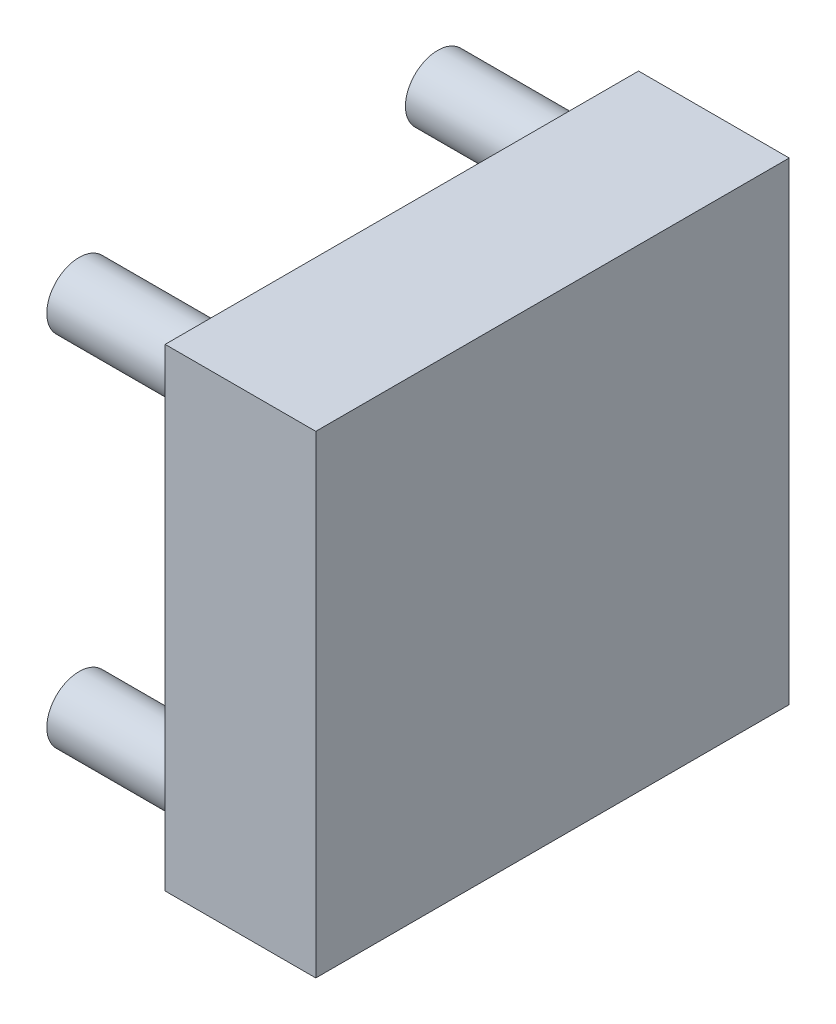
ISO-10303-21;
HEADER;
FILE_DESCRIPTION(('STEP AP214'),'2;1');
FILE_NAME('part.step','',(''),(''),'','','');
FILE_SCHEMA(('AUTOMOTIVE_DESIGN { 1 0 10303 214 1 1 1 1 }'));
ENDSEC;
DATA;
#1=APPLICATION_CONTEXT('core data for automotive mechanical design processes');
#2=APPLICATION_PROTOCOL_DEFINITION('international standard','automotive_design',2000,#1);
#3=PRODUCT_CONTEXT('',#1,'mechanical');
#4=PRODUCT('Part','Part','',(#3));
#5=PRODUCT_RELATED_PRODUCT_CATEGORY('part','',(#4));
#6=PRODUCT_DEFINITION_FORMATION('','',#4);
#7=PRODUCT_DEFINITION_CONTEXT('part definition',#1,'design');
#8=PRODUCT_DEFINITION('design','',#6,#7);
#9=PRODUCT_DEFINITION_SHAPE('','',#8);
#10=(LENGTH_UNIT() NAMED_UNIT(*) SI_UNIT(.MILLI.,.METRE.));
#11=(NAMED_UNIT(*) PLANE_ANGLE_UNIT() SI_UNIT($,.RADIAN.));
#12=(NAMED_UNIT(*) SI_UNIT($,.STERADIAN.) SOLID_ANGLE_UNIT());
#13=UNCERTAINTY_MEASURE_WITH_UNIT(LENGTH_MEASURE(1.E-05),#10,'distance_accuracy_value','');
#14=(GEOMETRIC_REPRESENTATION_CONTEXT(3) GLOBAL_UNCERTAINTY_ASSIGNED_CONTEXT((#13)) GLOBAL_UNIT_ASSIGNED_CONTEXT((#10,
#11,#12)) REPRESENTATION_CONTEXT('',''));
#15=CARTESIAN_POINT('',(0.,0.,0.));
#16=DIRECTION('',(0.,0.,1.));
#17=DIRECTION('',(1.,0.,0.));
#18=AXIS2_PLACEMENT_3D('',#15,#16,#17);
#19=CARTESIAN_POINT('',(10.5,-16.5,-16.5));
#20=DIRECTION('',(0.,0.,1.));
#21=DIRECTION('',(1.,0.,0.));
#22=AXIS2_PLACEMENT_3D('',#19,#20,#21);
#23=PLANE('',#22);
#24=DIRECTION('',(0.,1.,0.));
#25=VECTOR('',#24,1.);
#26=CARTESIAN_POINT('',(0.,-16.5,-16.5));
#27=LINE('',#26,#25);
#28=CARTESIAN_POINT('',(0.,-16.5,-16.5));
#29=VERTEX_POINT('',#28);
#30=CARTESIAN_POINT('',(0.,16.5,-16.5));
#31=VERTEX_POINT('',#30);
#32=EDGE_CURVE('E109',#29,#31,#27,.T.);
#33=ORIENTED_EDGE('',*,*,#32,.T.);
#34=DIRECTION('',(-1.,0.,0.));
#35=VECTOR('',#34,1.);
#36=CARTESIAN_POINT('',(10.5,16.5,-16.5));
#37=LINE('',#36,#35);
#38=CARTESIAN_POINT('',(10.5,16.5,-16.5));
#39=VERTEX_POINT('',#38);
#40=EDGE_CURVE('E46',#39,#31,#37,.T.);
#41=ORIENTED_EDGE('',*,*,#40,.F.);
#42=DIRECTION('',(0.,1.,0.));
#43=VECTOR('',#42,1.);
#44=CARTESIAN_POINT('',(10.5,-16.5,-16.5));
#45=LINE('',#44,#43);
#46=CARTESIAN_POINT('',(10.5,-16.5,-16.5));
#47=VERTEX_POINT('',#46);
#48=EDGE_CURVE('E100',#47,#39,#45,.T.);
#49=ORIENTED_EDGE('',*,*,#48,.F.);
#50=DIRECTION('',(-1.,0.,0.));
#51=VECTOR('',#50,1.);
#52=CARTESIAN_POINT('',(10.5,-16.5,-16.5));
#53=LINE('',#52,#51);
#54=EDGE_CURVE('E106',#47,#29,#53,.T.);
#55=ORIENTED_EDGE('',*,*,#54,.T.);
#56=EDGE_LOOP('',(#33,#41,#49,#55));
#57=FACE_BOUND('',#56,.T.);
#58=ADVANCED_FACE('F43',(#57),#23,.F.);
#59=CARTESIAN_POINT('',(10.5,16.5,16.5));
#60=DIRECTION('',(0.,-1.,0.));
#61=DIRECTION('',(0.,0.,-1.));
#62=AXIS2_PLACEMENT_3D('',#59,#60,#61);
#63=PLANE('',#62);
#64=DIRECTION('',(0.,0.,1.));
#65=VECTOR('',#64,1.);
#66=CARTESIAN_POINT('',(0.,16.5,16.5));
#67=LINE('',#66,#65);
#68=CARTESIAN_POINT('',(0.,16.5,16.5));
#69=VERTEX_POINT('',#68);
#70=EDGE_CURVE('E105',#31,#69,#67,.T.);
#71=ORIENTED_EDGE('',*,*,#70,.T.);
#72=DIRECTION('',(-1.,0.,0.));
#73=VECTOR('',#72,1.);
#74=CARTESIAN_POINT('',(10.5,16.5,16.5));
#75=LINE('',#74,#73);
#76=CARTESIAN_POINT('',(10.5,16.5,16.5));
#77=VERTEX_POINT('',#76);
#78=EDGE_CURVE('E99',#77,#69,#75,.T.);
#79=ORIENTED_EDGE('',*,*,#78,.F.);
#80=DIRECTION('',(0.,0.,1.));
#81=VECTOR('',#80,1.);
#82=CARTESIAN_POINT('',(10.5,16.5,16.5));
#83=LINE('',#82,#81);
#84=EDGE_CURVE('E95',#39,#77,#83,.T.);
#85=ORIENTED_EDGE('',*,*,#84,.F.);
#86=ORIENTED_EDGE('',*,*,#40,.T.);
#87=EDGE_LOOP('',(#71,#79,#85,#86));
#88=FACE_BOUND('',#87,.T.);
#89=ADVANCED_FACE('F101',(#88),#63,.F.);
#90=CARTESIAN_POINT('',(10.5,-16.5,16.5));
#91=DIRECTION('',(0.,0.,-1.));
#92=DIRECTION('',(-1.,0.,0.));
#93=AXIS2_PLACEMENT_3D('',#90,#91,#92);
#94=PLANE('',#93);
#95=DIRECTION('',(0.,-1.,0.));
#96=VECTOR('',#95,1.);
#97=CARTESIAN_POINT('',(0.,-16.5,16.5));
#98=LINE('',#97,#96);
#99=CARTESIAN_POINT('',(0.,-16.5,16.5));
#100=VERTEX_POINT('',#99);
#101=EDGE_CURVE('E77',#69,#100,#98,.T.);
#102=ORIENTED_EDGE('',*,*,#101,.T.);
#103=DIRECTION('',(-1.,0.,0.));
#104=VECTOR('',#103,1.);
#105=CARTESIAN_POINT('',(10.5,-16.5,16.5));
#106=LINE('',#105,#104);
#107=CARTESIAN_POINT('',(10.5,-16.5,16.5));
#108=VERTEX_POINT('',#107);
#109=EDGE_CURVE('E103',#108,#100,#106,.T.);
#110=ORIENTED_EDGE('',*,*,#109,.F.);
#111=DIRECTION('',(0.,-1.,0.));
#112=VECTOR('',#111,1.);
#113=CARTESIAN_POINT('',(10.5,-16.5,16.5));
#114=LINE('',#113,#112);
#115=EDGE_CURVE('E92',#77,#108,#114,.T.);
#116=ORIENTED_EDGE('',*,*,#115,.F.);
#117=ORIENTED_EDGE('',*,*,#78,.T.);
#118=EDGE_LOOP('',(#102,#110,#116,#117));
#119=FACE_BOUND('',#118,.T.);
#120=ADVANCED_FACE('F102',(#119),#94,.F.);
#121=CARTESIAN_POINT('',(10.5,-16.5,16.5));
#122=DIRECTION('',(0.,1.,0.));
#123=DIRECTION('',(0.,0.,1.));
#124=AXIS2_PLACEMENT_3D('',#121,#122,#123);
#125=PLANE('',#124);
#126=DIRECTION('',(0.,0.,-1.));
#127=VECTOR('',#126,1.);
#128=CARTESIAN_POINT('',(0.,-16.5,16.5));
#129=LINE('',#128,#127);
#130=EDGE_CURVE('E81',#100,#29,#129,.T.);
#131=ORIENTED_EDGE('',*,*,#130,.T.);
#132=ORIENTED_EDGE('',*,*,#54,.F.);
#133=DIRECTION('',(0.,0.,-1.));
#134=VECTOR('',#133,1.);
#135=CARTESIAN_POINT('',(10.5,-16.5,16.5));
#136=LINE('',#135,#134);
#137=EDGE_CURVE('E61',#108,#47,#136,.T.);
#138=ORIENTED_EDGE('',*,*,#137,.F.);
#139=ORIENTED_EDGE('',*,*,#109,.T.);
#140=EDGE_LOOP('',(#131,#132,#138,#139));
#141=FACE_BOUND('',#140,.T.);
#142=ADVANCED_FACE('F117',(#141),#125,.F.);
#143=CARTESIAN_POINT('',(10.5,0.,0.));
#144=DIRECTION('',(-1.,0.,0.));
#145=DIRECTION('',(0.,0.,1.));
#146=AXIS2_PLACEMENT_3D('',#143,#144,#145);
#147=PLANE('',#146);
#148=ORIENTED_EDGE('',*,*,#48,.T.);
#149=ORIENTED_EDGE('',*,*,#84,.T.);
#150=ORIENTED_EDGE('',*,*,#115,.T.);
#151=ORIENTED_EDGE('',*,*,#137,.T.);
#152=EDGE_LOOP('',(#148,#149,#150,#151));
#153=FACE_BOUND('',#152,.T.);
#154=ADVANCED_FACE('F91',(#153),#147,.F.);
#155=CARTESIAN_POINT('',(0.,0.,0.));
#156=DIRECTION('',(-1.,0.,0.));
#157=DIRECTION('',(0.,0.,1.));
#158=AXIS2_PLACEMENT_3D('',#155,#156,#157);
#159=PLANE('',#158);
#160=CARTESIAN_POINT('',(0.,12.5,12.5));
#161=DIRECTION('',(-1.,0.,0.));
#162=DIRECTION('',(0.,0.,1.));
#163=AXIS2_PLACEMENT_3D('',#160,#161,#162);
#164=CIRCLE('',#163,2.25);
#165=CARTESIAN_POINT('',(0.,12.5,14.75));
#166=VERTEX_POINT('',#165);
#167=EDGE_CURVE('E11',#166,#166,#164,.T.);
#168=ORIENTED_EDGE('',*,*,#167,.F.);
#169=EDGE_LOOP('',(#168));
#170=FACE_BOUND('',#169,.T.);
#171=CARTESIAN_POINT('',(0.,-12.5,12.5));
#172=DIRECTION('',(-1.,0.,0.));
#173=DIRECTION('',(0.,0.,1.));
#174=AXIS2_PLACEMENT_3D('',#171,#172,#173);
#175=CIRCLE('',#174,2.25);
#176=CARTESIAN_POINT('',(0.,-12.5,14.75));
#177=VERTEX_POINT('',#176);
#178=EDGE_CURVE('E55',#177,#177,#175,.T.);
#179=ORIENTED_EDGE('',*,*,#178,.F.);
#180=EDGE_LOOP('',(#179));
#181=FACE_BOUND('',#180,.T.);
#182=CARTESIAN_POINT('',(0.,-12.5,-12.5));
#183=DIRECTION('',(-1.,0.,0.));
#184=DIRECTION('',(0.,0.,1.));
#185=AXIS2_PLACEMENT_3D('',#182,#183,#184);
#186=CIRCLE('',#185,2.25);
#187=CARTESIAN_POINT('',(0.,-12.5,-10.25));
#188=VERTEX_POINT('',#187);
#189=EDGE_CURVE('E130',#188,#188,#186,.T.);
#190=ORIENTED_EDGE('',*,*,#189,.F.);
#191=EDGE_LOOP('',(#190));
#192=FACE_BOUND('',#191,.T.);
#193=CARTESIAN_POINT('',(0.,12.5,-12.5));
#194=DIRECTION('',(-1.,0.,0.));
#195=DIRECTION('',(0.,0.,1.));
#196=AXIS2_PLACEMENT_3D('',#193,#194,#195);
#197=CIRCLE('',#196,2.25);
#198=CARTESIAN_POINT('',(0.,12.5,-10.25));
#199=VERTEX_POINT('',#198);
#200=EDGE_CURVE('E121',#199,#199,#197,.T.);
#201=ORIENTED_EDGE('',*,*,#200,.F.);
#202=EDGE_LOOP('',(#201));
#203=FACE_BOUND('',#202,.T.);
#204=ORIENTED_EDGE('',*,*,#32,.F.);
#205=ORIENTED_EDGE('',*,*,#130,.F.);
#206=ORIENTED_EDGE('',*,*,#101,.F.);
#207=ORIENTED_EDGE('',*,*,#70,.F.);
#208=EDGE_LOOP('',(#204,#205,#206,#207));
#209=FACE_BOUND('',#208,.T.);
#210=ADVANCED_FACE('F122',(#170,#181,#192,#203,#209),#159,.T.);
#211=CARTESIAN_POINT('',(-10.,12.5,-12.5));
#212=DIRECTION('',(-1.,0.,0.));
#213=DIRECTION('',(0.,0.,1.));
#214=AXIS2_PLACEMENT_3D('',#211,#212,#213);
#215=PLANE('',#214);
#216=CARTESIAN_POINT('',(-10.,12.5,-12.5));
#217=DIRECTION('',(-1.,0.,0.));
#218=DIRECTION('',(0.,0.,1.));
#219=AXIS2_PLACEMENT_3D('',#216,#217,#218);
#220=CIRCLE('',#219,2.25);
#221=CARTESIAN_POINT('',(-10.,12.5,-10.25));
#222=VERTEX_POINT('',#221);
#223=EDGE_CURVE('E114',#222,#222,#220,.T.);
#224=ORIENTED_EDGE('',*,*,#223,.T.);
#225=EDGE_LOOP('',(#224));
#226=FACE_BOUND('',#225,.T.);
#227=CARTESIAN_POINT('',(-10.,12.5,-12.5));
#228=DIRECTION('',(-1.,0.,0.));
#229=DIRECTION('',(0.,0.,1.));
#230=AXIS2_PLACEMENT_3D('',#227,#228,#229);
#231=CIRCLE('',#230,1.5);
#232=CARTESIAN_POINT('',(-10.,12.5,-11.));
#233=VERTEX_POINT('',#232);
#234=EDGE_CURVE('E128',#233,#233,#231,.T.);
#235=ORIENTED_EDGE('',*,*,#234,.F.);
#236=EDGE_LOOP('',(#235));
#237=FACE_BOUND('',#236,.T.);
#238=ADVANCED_FACE('F175',(#226,#237),#215,.T.);
#239=CARTESIAN_POINT('',(-10.,12.5,-12.5));
#240=DIRECTION('',(1.,0.,0.));
#241=DIRECTION('',(0.,0.,-1.));
#242=AXIS2_PLACEMENT_3D('',#239,#240,#241);
#243=CYLINDRICAL_SURFACE('',#242,2.25);
#244=ORIENTED_EDGE('',*,*,#223,.F.);
#245=EDGE_LOOP('',(#244));
#246=FACE_BOUND('',#245,.T.);
#247=ORIENTED_EDGE('',*,*,#200,.T.);
#248=EDGE_LOOP('',(#247));
#249=FACE_BOUND('',#248,.T.);
#250=ADVANCED_FACE('F176',(#246,#249),#243,.T.);
#251=CARTESIAN_POINT('',(-10.,12.5,-12.5));
#252=DIRECTION('',(1.,0.,0.));
#253=DIRECTION('',(0.,0.,-1.));
#254=AXIS2_PLACEMENT_3D('',#251,#252,#253);
#255=CYLINDRICAL_SURFACE('',#254,1.5);
#256=ORIENTED_EDGE('',*,*,#234,.T.);
#257=EDGE_LOOP('',(#256));
#258=FACE_BOUND('',#257,.T.);
#259=CARTESIAN_POINT('',(0.,12.5,-12.5));
#260=DIRECTION('',(-1.,0.,0.));
#261=DIRECTION('',(0.,0.,1.));
#262=AXIS2_PLACEMENT_3D('',#259,#260,#261);
#263=CIRCLE('',#262,1.5);
#264=CARTESIAN_POINT('',(0.,12.5,-11.));
#265=VERTEX_POINT('',#264);
#266=EDGE_CURVE('E131',#265,#265,#263,.T.);
#267=ORIENTED_EDGE('',*,*,#266,.F.);
#268=EDGE_LOOP('',(#267));
#269=FACE_BOUND('',#268,.T.);
#270=ADVANCED_FACE('F182',(#258,#269),#255,.F.);
#271=CARTESIAN_POINT('',(-10.,-12.5,-12.5));
#272=DIRECTION('',(-1.,0.,0.));
#273=DIRECTION('',(0.,0.,1.));
#274=AXIS2_PLACEMENT_3D('',#271,#272,#273);
#275=PLANE('',#274);
#276=CARTESIAN_POINT('',(-10.,-12.5,-12.5));
#277=DIRECTION('',(-1.,0.,0.));
#278=DIRECTION('',(0.,0.,1.));
#279=AXIS2_PLACEMENT_3D('',#276,#277,#278);
#280=CIRCLE('',#279,2.25);
#281=CARTESIAN_POINT('',(-10.,-12.5,-10.25));
#282=VERTEX_POINT('',#281);
#283=EDGE_CURVE('E153',#282,#282,#280,.T.);
#284=ORIENTED_EDGE('',*,*,#283,.T.);
#285=EDGE_LOOP('',(#284));
#286=FACE_BOUND('',#285,.T.);
#287=CARTESIAN_POINT('',(-10.,-12.5,-12.5));
#288=DIRECTION('',(-1.,0.,0.));
#289=DIRECTION('',(0.,0.,1.));
#290=AXIS2_PLACEMENT_3D('',#287,#288,#289);
#291=CIRCLE('',#290,1.5);
#292=CARTESIAN_POINT('',(-10.,-12.5,-11.));
#293=VERTEX_POINT('',#292);
#294=EDGE_CURVE('E158',#293,#293,#291,.T.);
#295=ORIENTED_EDGE('',*,*,#294,.F.);
#296=EDGE_LOOP('',(#295));
#297=FACE_BOUND('',#296,.T.);
#298=ADVANCED_FACE('F187',(#286,#297),#275,.T.);
#299=CARTESIAN_POINT('',(-10.,-12.5,-12.5));
#300=DIRECTION('',(1.,0.,0.));
#301=DIRECTION('',(0.,0.,-1.));
#302=AXIS2_PLACEMENT_3D('',#299,#300,#301);
#303=CYLINDRICAL_SURFACE('',#302,2.25);
#304=ORIENTED_EDGE('',*,*,#283,.F.);
#305=EDGE_LOOP('',(#304));
#306=FACE_BOUND('',#305,.T.);
#307=ORIENTED_EDGE('',*,*,#189,.T.);
#308=EDGE_LOOP('',(#307));
#309=FACE_BOUND('',#308,.T.);
#310=ADVANCED_FACE('F169',(#306,#309),#303,.T.);
#311=CARTESIAN_POINT('',(-10.,-12.5,-12.5));
#312=DIRECTION('',(1.,0.,0.));
#313=DIRECTION('',(0.,0.,-1.));
#314=AXIS2_PLACEMENT_3D('',#311,#312,#313);
#315=CYLINDRICAL_SURFACE('',#314,1.5);
#316=ORIENTED_EDGE('',*,*,#294,.T.);
#317=EDGE_LOOP('',(#316));
#318=FACE_BOUND('',#317,.T.);
#319=CARTESIAN_POINT('',(0.,-12.5,-12.5));
#320=DIRECTION('',(-1.,0.,0.));
#321=DIRECTION('',(0.,0.,1.));
#322=AXIS2_PLACEMENT_3D('',#319,#320,#321);
#323=CIRCLE('',#322,1.5);
#324=CARTESIAN_POINT('',(0.,-12.5,-11.));
#325=VERTEX_POINT('',#324);
#326=EDGE_CURVE('E133',#325,#325,#323,.T.);
#327=ORIENTED_EDGE('',*,*,#326,.F.);
#328=EDGE_LOOP('',(#327));
#329=FACE_BOUND('',#328,.T.);
#330=ADVANCED_FACE('F254',(#318,#329),#315,.F.);
#331=CARTESIAN_POINT('',(-10.,-12.5,12.5));
#332=DIRECTION('',(-1.,0.,0.));
#333=DIRECTION('',(0.,0.,1.));
#334=AXIS2_PLACEMENT_3D('',#331,#332,#333);
#335=PLANE('',#334);
#336=CARTESIAN_POINT('',(-10.,-12.5,12.5));
#337=DIRECTION('',(-1.,0.,0.));
#338=DIRECTION('',(0.,0.,1.));
#339=AXIS2_PLACEMENT_3D('',#336,#337,#338);
#340=CIRCLE('',#339,2.25);
#341=CARTESIAN_POINT('',(-10.,-12.5,14.75));
#342=VERTEX_POINT('',#341);
#343=EDGE_CURVE('E145',#342,#342,#340,.T.);
#344=ORIENTED_EDGE('',*,*,#343,.T.);
#345=EDGE_LOOP('',(#344));
#346=FACE_BOUND('',#345,.T.);
#347=CARTESIAN_POINT('',(-10.,-12.5,12.5));
#348=DIRECTION('',(-1.,0.,0.));
#349=DIRECTION('',(0.,0.,1.));
#350=AXIS2_PLACEMENT_3D('',#347,#348,#349);
#351=CIRCLE('',#350,1.5);
#352=CARTESIAN_POINT('',(-10.,-12.5,14.));
#353=VERTEX_POINT('',#352);
#354=EDGE_CURVE('E150',#353,#353,#351,.T.);
#355=ORIENTED_EDGE('',*,*,#354,.F.);
#356=EDGE_LOOP('',(#355));
#357=FACE_BOUND('',#356,.T.);
#358=ADVANCED_FACE('F264',(#346,#357),#335,.T.);
#359=CARTESIAN_POINT('',(-10.,-12.5,12.5));
#360=DIRECTION('',(1.,0.,0.));
#361=DIRECTION('',(0.,0.,-1.));
#362=AXIS2_PLACEMENT_3D('',#359,#360,#361);
#363=CYLINDRICAL_SURFACE('',#362,2.25);
#364=ORIENTED_EDGE('',*,*,#343,.F.);
#365=EDGE_LOOP('',(#364));
#366=FACE_BOUND('',#365,.T.);
#367=ORIENTED_EDGE('',*,*,#178,.T.);
#368=EDGE_LOOP('',(#367));
#369=FACE_BOUND('',#368,.T.);
#370=ADVANCED_FACE('F274',(#366,#369),#363,.T.);
#371=CARTESIAN_POINT('',(-10.,-12.5,12.5));
#372=DIRECTION('',(1.,0.,0.));
#373=DIRECTION('',(0.,0.,-1.));
#374=AXIS2_PLACEMENT_3D('',#371,#372,#373);
#375=CYLINDRICAL_SURFACE('',#374,1.5);
#376=ORIENTED_EDGE('',*,*,#354,.T.);
#377=EDGE_LOOP('',(#376));
#378=FACE_BOUND('',#377,.T.);
#379=CARTESIAN_POINT('',(0.,-12.5,12.5));
#380=DIRECTION('',(-1.,0.,0.));
#381=DIRECTION('',(0.,0.,1.));
#382=AXIS2_PLACEMENT_3D('',#379,#380,#381);
#383=CIRCLE('',#382,1.5);
#384=CARTESIAN_POINT('',(0.,-12.5,14.));
#385=VERTEX_POINT('',#384);
#386=EDGE_CURVE('E147',#385,#385,#383,.T.);
#387=ORIENTED_EDGE('',*,*,#386,.F.);
#388=EDGE_LOOP('',(#387));
#389=FACE_BOUND('',#388,.T.);
#390=ADVANCED_FACE('F284',(#378,#389),#375,.F.);
#391=CARTESIAN_POINT('',(-10.,12.5,12.5));
#392=DIRECTION('',(-1.,0.,0.));
#393=DIRECTION('',(0.,0.,1.));
#394=AXIS2_PLACEMENT_3D('',#391,#392,#393);
#395=PLANE('',#394);
#396=CARTESIAN_POINT('',(-10.,12.5,12.5));
#397=DIRECTION('',(-1.,0.,0.));
#398=DIRECTION('',(0.,0.,1.));
#399=AXIS2_PLACEMENT_3D('',#396,#397,#398);
#400=CIRCLE('',#399,2.25);
#401=CARTESIAN_POINT('',(-10.,12.5,14.75));
#402=VERTEX_POINT('',#401);
#403=EDGE_CURVE('E143',#402,#402,#400,.T.);
#404=ORIENTED_EDGE('',*,*,#403,.T.);
#405=EDGE_LOOP('',(#404));
#406=FACE_BOUND('',#405,.T.);
#407=CARTESIAN_POINT('',(-10.,12.5,12.5));
#408=DIRECTION('',(-1.,0.,0.));
#409=DIRECTION('',(0.,0.,1.));
#410=AXIS2_PLACEMENT_3D('',#407,#408,#409);
#411=CIRCLE('',#410,1.5);
#412=CARTESIAN_POINT('',(-10.,12.5,14.));
#413=VERTEX_POINT('',#412);
#414=EDGE_CURVE('E139',#413,#413,#411,.T.);
#415=ORIENTED_EDGE('',*,*,#414,.F.);
#416=EDGE_LOOP('',(#415));
#417=FACE_BOUND('',#416,.T.);
#418=ADVANCED_FACE('F293',(#406,#417),#395,.T.);
#419=CARTESIAN_POINT('',(-10.,12.5,12.5));
#420=DIRECTION('',(1.,0.,0.));
#421=DIRECTION('',(0.,0.,-1.));
#422=AXIS2_PLACEMENT_3D('',#419,#420,#421);
#423=CYLINDRICAL_SURFACE('',#422,2.25);
#424=ORIENTED_EDGE('',*,*,#403,.F.);
#425=EDGE_LOOP('',(#424));
#426=FACE_BOUND('',#425,.T.);
#427=ORIENTED_EDGE('',*,*,#167,.T.);
#428=EDGE_LOOP('',(#427));
#429=FACE_BOUND('',#428,.T.);
#430=ADVANCED_FACE('F303',(#426,#429),#423,.T.);
#431=CARTESIAN_POINT('',(-10.,12.5,12.5));
#432=DIRECTION('',(1.,0.,0.));
#433=DIRECTION('',(0.,0.,-1.));
#434=AXIS2_PLACEMENT_3D('',#431,#432,#433);
#435=CYLINDRICAL_SURFACE('',#434,1.5);
#436=ORIENTED_EDGE('',*,*,#414,.T.);
#437=EDGE_LOOP('',(#436));
#438=FACE_BOUND('',#437,.T.);
#439=CARTESIAN_POINT('',(0.,12.5,12.5));
#440=DIRECTION('',(-1.,0.,0.));
#441=DIRECTION('',(0.,0.,1.));
#442=AXIS2_PLACEMENT_3D('',#439,#440,#441);
#443=CIRCLE('',#442,1.5);
#444=CARTESIAN_POINT('',(0.,12.5,14.));
#445=VERTEX_POINT('',#444);
#446=EDGE_CURVE('E138',#445,#445,#443,.T.);
#447=ORIENTED_EDGE('',*,*,#446,.F.);
#448=EDGE_LOOP('',(#447));
#449=FACE_BOUND('',#448,.T.);
#450=ADVANCED_FACE('F312',(#438,#449),#435,.F.);
#451=ORIENTED_EDGE('',*,*,#266,.T.);
#452=EDGE_LOOP('',(#451));
#453=FACE_BOUND('',#452,.T.);
#454=ADVANCED_FACE('F177',(#453),#159,.T.);
#455=ORIENTED_EDGE('',*,*,#326,.T.);
#456=EDGE_LOOP('',(#455));
#457=FACE_BOUND('',#456,.T.);
#458=ADVANCED_FACE('F335',(#457),#159,.T.);
#459=ORIENTED_EDGE('',*,*,#386,.T.);
#460=EDGE_LOOP('',(#459));
#461=FACE_BOUND('',#460,.T.);
#462=ADVANCED_FACE('F337',(#461),#159,.T.);
#463=ORIENTED_EDGE('',*,*,#446,.T.);
#464=EDGE_LOOP('',(#463));
#465=FACE_BOUND('',#464,.T.);
#466=ADVANCED_FACE('F174',(#465),#159,.T.);
#467=CLOSED_SHELL('',(#58,#89,#120,#142,#154,#210,#238,#250,#270,#298,#310,#330,#358,#370,#390,
#418,#430,#450,#454,#458,#462,#466));
#468=MANIFOLD_SOLID_BREP('B2',#467);
#469=ADVANCED_BREP_SHAPE_REPRESENTATION('',(#18,#468),#14);
#470=SHAPE_DEFINITION_REPRESENTATION(#9,#469);
ENDSEC;
END-ISO-10303-21;
